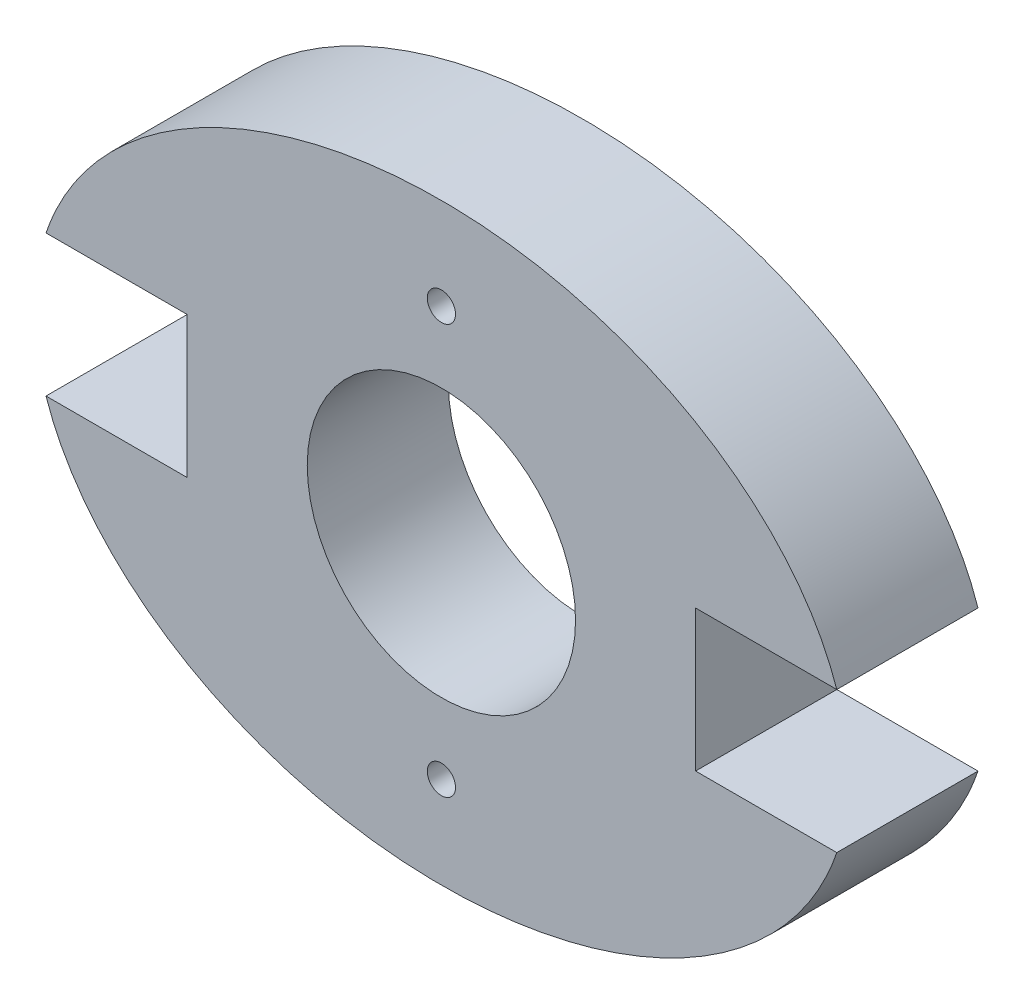
ISO-10303-21;
HEADER;
FILE_DESCRIPTION(('STEP AP214'),'2;1');
FILE_NAME('part.step','',(''),(''),'','','');
FILE_SCHEMA(('AUTOMOTIVE_DESIGN { 1 0 10303 214 1 1 1 1 }'));
ENDSEC;
DATA;
#1=APPLICATION_CONTEXT('core data for automotive mechanical design processes');
#2=APPLICATION_PROTOCOL_DEFINITION('international standard','automotive_design',2000,#1);
#3=PRODUCT_CONTEXT('',#1,'mechanical');
#4=PRODUCT('Part','Part','',(#3));
#5=PRODUCT_RELATED_PRODUCT_CATEGORY('part','',(#4));
#6=PRODUCT_DEFINITION_FORMATION('','',#4);
#7=PRODUCT_DEFINITION_CONTEXT('part definition',#1,'design');
#8=PRODUCT_DEFINITION('design','',#6,#7);
#9=PRODUCT_DEFINITION_SHAPE('','',#8);
#10=(LENGTH_UNIT() NAMED_UNIT(*) SI_UNIT(.MILLI.,.METRE.));
#11=(NAMED_UNIT(*) PLANE_ANGLE_UNIT() SI_UNIT($,.RADIAN.));
#12=(NAMED_UNIT(*) SI_UNIT($,.STERADIAN.) SOLID_ANGLE_UNIT());
#13=UNCERTAINTY_MEASURE_WITH_UNIT(LENGTH_MEASURE(1.E-05),#10,'distance_accuracy_value','');
#14=(GEOMETRIC_REPRESENTATION_CONTEXT(3) GLOBAL_UNCERTAINTY_ASSIGNED_CONTEXT((#13)) GLOBAL_UNIT_ASSIGNED_CONTEXT((#10,
#11,#12)) REPRESENTATION_CONTEXT('',''));
#15=CARTESIAN_POINT('',(0.,0.,0.));
#16=DIRECTION('',(0.,0.,1.));
#17=DIRECTION('',(1.,0.,0.));
#18=AXIS2_PLACEMENT_3D('',#15,#16,#17);
#19=CARTESIAN_POINT('',(0.,0.,5.));
#20=DIRECTION('',(0.,0.,-1.));
#21=DIRECTION('',(-1.,0.,0.));
#22=AXIS2_PLACEMENT_3D('',#19,#20,#21);
#23=PLANE('',#22);
#24=CARTESIAN_POINT('',(0.,-7.25449999999413,5.));
#25=DIRECTION('',(0.,0.,1.));
#26=DIRECTION('',(1.,0.,0.));
#27=AXIS2_PLACEMENT_3D('',#24,#25,#26);
#28=CIRCLE('',#27,0.499999999997022);
#29=CARTESIAN_POINT('',(0.499999999997022,-7.25449999999413,5.));
#30=VERTEX_POINT('',#29);
#31=EDGE_CURVE('E303',#30,#30,#28,.T.);
#32=ORIENTED_EDGE('',*,*,#31,.F.);
#33=EDGE_LOOP('',(#32));
#34=FACE_BOUND('',#33,.T.);
#35=CARTESIAN_POINT('',(0.,0.,5.));
#36=DIRECTION('',(0.,0.,1.));
#37=DIRECTION('',(1.,0.,0.));
#38=AXIS2_PLACEMENT_3D('',#35,#36,#37);
#39=ELLIPSE('',#38,14.4145359326565,10.5);
#40=CARTESIAN_POINT('',(14.,2.5,5.));
#41=VERTEX_POINT('',#40);
#42=CARTESIAN_POINT('',(-14.,2.5,5.));
#43=VERTEX_POINT('',#42);
#44=EDGE_CURVE('E145',#41,#43,#39,.T.);
#45=ORIENTED_EDGE('',*,*,#44,.T.);
#46=DIRECTION('',(1.,0.,0.));
#47=VECTOR('',#46,1.);
#48=CARTESIAN_POINT('',(-14.,2.5,5.));
#49=LINE('',#48,#47);
#50=CARTESIAN_POINT('',(-9.,2.5,5.));
#51=VERTEX_POINT('',#50);
#52=EDGE_CURVE('E93',#43,#51,#49,.T.);
#53=ORIENTED_EDGE('',*,*,#52,.T.);
#54=DIRECTION('',(0.,-1.,0.));
#55=VECTOR('',#54,1.);
#56=CARTESIAN_POINT('',(-9.,2.5,5.));
#57=LINE('',#56,#55);
#58=CARTESIAN_POINT('',(-9.,-2.5,5.));
#59=VERTEX_POINT('',#58);
#60=EDGE_CURVE('E160',#51,#59,#57,.T.);
#61=ORIENTED_EDGE('',*,*,#60,.T.);
#62=DIRECTION('',(-1.,0.,0.));
#63=VECTOR('',#62,1.);
#64=CARTESIAN_POINT('',(-14.,-2.5,5.));
#65=LINE('',#64,#63);
#66=CARTESIAN_POINT('',(-14.,-2.5,5.));
#67=VERTEX_POINT('',#66);
#68=EDGE_CURVE('E173',#59,#67,#65,.T.);
#69=ORIENTED_EDGE('',*,*,#68,.T.);
#70=CARTESIAN_POINT('',(0.,0.,5.));
#71=DIRECTION('',(0.,0.,1.));
#72=DIRECTION('',(1.,0.,0.));
#73=AXIS2_PLACEMENT_3D('',#70,#71,#72);
#74=ELLIPSE('',#73,14.4145359326565,10.5);
#75=CARTESIAN_POINT('',(14.,-2.5,5.));
#76=VERTEX_POINT('',#75);
#77=EDGE_CURVE('E112',#67,#76,#74,.T.);
#78=ORIENTED_EDGE('',*,*,#77,.T.);
#79=DIRECTION('',(-1.,0.,0.));
#80=VECTOR('',#79,1.);
#81=CARTESIAN_POINT('',(14.,-2.5,5.));
#82=LINE('',#81,#80);
#83=CARTESIAN_POINT('',(9.,-2.5,5.));
#84=VERTEX_POINT('',#83);
#85=EDGE_CURVE('E106',#76,#84,#82,.T.);
#86=ORIENTED_EDGE('',*,*,#85,.T.);
#87=DIRECTION('',(0.,1.,0.));
#88=VECTOR('',#87,1.);
#89=CARTESIAN_POINT('',(9.,2.5,5.));
#90=LINE('',#89,#88);
#91=CARTESIAN_POINT('',(9.,2.5,5.));
#92=VERTEX_POINT('',#91);
#93=EDGE_CURVE('E110',#84,#92,#90,.T.);
#94=ORIENTED_EDGE('',*,*,#93,.T.);
#95=DIRECTION('',(1.,0.,0.));
#96=VECTOR('',#95,1.);
#97=CARTESIAN_POINT('',(14.,2.5,5.));
#98=LINE('',#97,#96);
#99=EDGE_CURVE('E50',#92,#41,#98,.T.);
#100=ORIENTED_EDGE('',*,*,#99,.T.);
#101=EDGE_LOOP('',(#45,#53,#61,#69,#78,#86,#94,#100));
#102=FACE_BOUND('',#101,.T.);
#103=CARTESIAN_POINT('',(3.11417199942654E-12,7.25450000000587,5.));
#104=DIRECTION('',(0.,0.,1.));
#105=DIRECTION('',(1.,0.,0.));
#106=AXIS2_PLACEMENT_3D('',#103,#104,#105);
#107=CIRCLE('',#106,0.5);
#108=CARTESIAN_POINT('',(0.500000000003114,7.25450000000587,5.));
#109=VERTEX_POINT('',#108);
#110=EDGE_CURVE('E134',#109,#109,#107,.T.);
#111=ORIENTED_EDGE('',*,*,#110,.F.);
#112=EDGE_LOOP('',(#111));
#113=FACE_BOUND('',#112,.T.);
#114=CARTESIAN_POINT('',(0.,0.,5.));
#115=DIRECTION('',(0.,0.,1.));
#116=DIRECTION('',(1.,0.,0.));
#117=AXIS2_PLACEMENT_3D('',#114,#115,#116);
#118=CIRCLE('',#117,4.75000000000001);
#119=CARTESIAN_POINT('',(4.75000000000001,0.,5.));
#120=VERTEX_POINT('',#119);
#121=EDGE_CURVE('E294',#120,#120,#118,.T.);
#122=ORIENTED_EDGE('',*,*,#121,.F.);
#123=EDGE_LOOP('',(#122));
#124=FACE_BOUND('',#123,.T.);
#125=ADVANCED_FACE('F32',(#34,#102,#113,#124),#23,.F.);
#126=CARTESIAN_POINT('',(0.,0.,0.));
#127=DIRECTION('',(0.,0.,-1.));
#128=DIRECTION('',(-1.,0.,0.));
#129=AXIS2_PLACEMENT_3D('',#126,#127,#128);
#130=PLANE('',#129);
#131=CARTESIAN_POINT('',(0.,-7.25449999999413,0.));
#132=DIRECTION('',(0.,0.,1.));
#133=DIRECTION('',(1.,0.,0.));
#134=AXIS2_PLACEMENT_3D('',#131,#132,#133);
#135=CIRCLE('',#134,0.499999999997022);
#136=CARTESIAN_POINT('',(0.499999999997022,-7.25449999999413,0.));
#137=VERTEX_POINT('',#136);
#138=EDGE_CURVE('E300',#137,#137,#135,.T.);
#139=ORIENTED_EDGE('',*,*,#138,.T.);
#140=EDGE_LOOP('',(#139));
#141=FACE_BOUND('',#140,.T.);
#142=CARTESIAN_POINT('',(0.,0.,0.));
#143=DIRECTION('',(0.,0.,1.));
#144=DIRECTION('',(1.,0.,0.));
#145=AXIS2_PLACEMENT_3D('',#142,#143,#144);
#146=ELLIPSE('',#145,14.4145359326565,10.5);
#147=CARTESIAN_POINT('',(14.,2.5,0.));
#148=VERTEX_POINT('',#147);
#149=CARTESIAN_POINT('',(-14.,2.5,0.));
#150=VERTEX_POINT('',#149);
#151=EDGE_CURVE('E130',#148,#150,#146,.T.);
#152=ORIENTED_EDGE('',*,*,#151,.F.);
#153=DIRECTION('',(1.,0.,0.));
#154=VECTOR('',#153,1.);
#155=CARTESIAN_POINT('',(14.,2.5,0.));
#156=LINE('',#155,#154);
#157=CARTESIAN_POINT('',(9.,2.5,0.));
#158=VERTEX_POINT('',#157);
#159=EDGE_CURVE('E85',#158,#148,#156,.T.);
#160=ORIENTED_EDGE('',*,*,#159,.F.);
#161=DIRECTION('',(0.,1.,0.));
#162=VECTOR('',#161,1.);
#163=CARTESIAN_POINT('',(9.,2.5,0.));
#164=LINE('',#163,#162);
#165=CARTESIAN_POINT('',(9.,-2.5,0.));
#166=VERTEX_POINT('',#165);
#167=EDGE_CURVE('E79',#166,#158,#164,.T.);
#168=ORIENTED_EDGE('',*,*,#167,.F.);
#169=DIRECTION('',(-1.,0.,0.));
#170=VECTOR('',#169,1.);
#171=CARTESIAN_POINT('',(14.,-2.5,0.));
#172=LINE('',#171,#170);
#173=CARTESIAN_POINT('',(14.,-2.5,0.));
#174=VERTEX_POINT('',#173);
#175=EDGE_CURVE('E120',#174,#166,#172,.T.);
#176=ORIENTED_EDGE('',*,*,#175,.F.);
#177=CARTESIAN_POINT('',(0.,0.,0.));
#178=DIRECTION('',(0.,0.,1.));
#179=DIRECTION('',(1.,0.,0.));
#180=AXIS2_PLACEMENT_3D('',#177,#178,#179);
#181=ELLIPSE('',#180,14.4145359326565,10.5);
#182=CARTESIAN_POINT('',(-14.,-2.5,0.));
#183=VERTEX_POINT('',#182);
#184=EDGE_CURVE('E140',#183,#174,#181,.T.);
#185=ORIENTED_EDGE('',*,*,#184,.F.);
#186=DIRECTION('',(-1.,0.,0.));
#187=VECTOR('',#186,1.);
#188=CARTESIAN_POINT('',(-14.,-2.5,0.));
#189=LINE('',#188,#187);
#190=CARTESIAN_POINT('',(-9.,-2.5,0.));
#191=VERTEX_POINT('',#190);
#192=EDGE_CURVE('E138',#191,#183,#189,.T.);
#193=ORIENTED_EDGE('',*,*,#192,.F.);
#194=DIRECTION('',(0.,-1.,0.));
#195=VECTOR('',#194,1.);
#196=CARTESIAN_POINT('',(-9.,2.5,0.));
#197=LINE('',#196,#195);
#198=CARTESIAN_POINT('',(-9.,2.5,0.));
#199=VERTEX_POINT('',#198);
#200=EDGE_CURVE('E136',#199,#191,#197,.T.);
#201=ORIENTED_EDGE('',*,*,#200,.F.);
#202=DIRECTION('',(1.,0.,0.));
#203=VECTOR('',#202,1.);
#204=CARTESIAN_POINT('',(-14.,2.5,0.));
#205=LINE('',#204,#203);
#206=EDGE_CURVE('E133',#150,#199,#205,.T.);
#207=ORIENTED_EDGE('',*,*,#206,.F.);
#208=EDGE_LOOP('',(#152,#160,#168,#176,#185,#193,#201,#207));
#209=FACE_BOUND('',#208,.T.);
#210=CARTESIAN_POINT('',(3.11417199942654E-12,7.25450000000587,0.));
#211=DIRECTION('',(0.,0.,1.));
#212=DIRECTION('',(1.,0.,0.));
#213=AXIS2_PLACEMENT_3D('',#210,#211,#212);
#214=CIRCLE('',#213,0.5);
#215=CARTESIAN_POINT('',(0.500000000003114,7.25450000000587,0.));
#216=VERTEX_POINT('',#215);
#217=EDGE_CURVE('E306',#216,#216,#214,.T.);
#218=ORIENTED_EDGE('',*,*,#217,.T.);
#219=EDGE_LOOP('',(#218));
#220=FACE_BOUND('',#219,.T.);
#221=CARTESIAN_POINT('',(0.,0.,0.));
#222=DIRECTION('',(0.,0.,1.));
#223=DIRECTION('',(1.,0.,0.));
#224=AXIS2_PLACEMENT_3D('',#221,#222,#223);
#225=CIRCLE('',#224,4.75000000000001);
#226=CARTESIAN_POINT('',(4.75000000000001,0.,0.));
#227=VERTEX_POINT('',#226);
#228=EDGE_CURVE('E297',#227,#227,#225,.T.);
#229=ORIENTED_EDGE('',*,*,#228,.T.);
#230=EDGE_LOOP('',(#229));
#231=FACE_BOUND('',#230,.T.);
#232=ADVANCED_FACE('F164',(#141,#209,#220,#231),#130,.T.);
#233=DIRECTION('',(0.,0.,-1.));
#234=VECTOR('',#233,1.);
#235=SURFACE_OF_LINEAR_EXTRUSION('',#39,#234);
#236=ORIENTED_EDGE('',*,*,#151,.T.);
#237=DIRECTION('',(0.,0.,-1.));
#238=VECTOR('',#237,1.);
#239=CARTESIAN_POINT('',(-14.,2.5,5.));
#240=LINE('',#239,#238);
#241=EDGE_CURVE('E11',#43,#150,#240,.T.);
#242=ORIENTED_EDGE('',*,*,#241,.F.);
#243=ORIENTED_EDGE('',*,*,#44,.F.);
#244=DIRECTION('',(0.,0.,-1.));
#245=VECTOR('',#244,1.);
#246=CARTESIAN_POINT('',(14.,2.5,5.));
#247=LINE('',#246,#245);
#248=EDGE_CURVE('E126',#41,#148,#247,.T.);
#249=ORIENTED_EDGE('',*,*,#248,.T.);
#250=EDGE_LOOP('',(#236,#242,#243,#249));
#251=FACE_BOUND('',#250,.T.);
#252=ADVANCED_FACE('F34',(#251),#235,.F.);
#253=CARTESIAN_POINT('',(-14.,2.5,5.));
#254=DIRECTION('',(0.,1.,0.));
#255=DIRECTION('',(0.,0.,1.));
#256=AXIS2_PLACEMENT_3D('',#253,#254,#255);
#257=PLANE('',#256);
#258=ORIENTED_EDGE('',*,*,#206,.T.);
#259=DIRECTION('',(0.,0.,-1.));
#260=VECTOR('',#259,1.);
#261=CARTESIAN_POINT('',(-9.,2.5,5.));
#262=LINE('',#261,#260);
#263=EDGE_CURVE('E42',#51,#199,#262,.T.);
#264=ORIENTED_EDGE('',*,*,#263,.F.);
#265=ORIENTED_EDGE('',*,*,#52,.F.);
#266=ORIENTED_EDGE('',*,*,#241,.T.);
#267=EDGE_LOOP('',(#258,#264,#265,#266));
#268=FACE_BOUND('',#267,.T.);
#269=ADVANCED_FACE('F185',(#268),#257,.F.);
#270=CARTESIAN_POINT('',(-9.,2.5,5.));
#271=DIRECTION('',(1.,0.,0.));
#272=DIRECTION('',(0.,0.,-1.));
#273=AXIS2_PLACEMENT_3D('',#270,#271,#272);
#274=PLANE('',#273);
#275=ORIENTED_EDGE('',*,*,#200,.T.);
#276=DIRECTION('',(0.,0.,-1.));
#277=VECTOR('',#276,1.);
#278=CARTESIAN_POINT('',(-9.,-2.5,5.));
#279=LINE('',#278,#277);
#280=EDGE_CURVE('E152',#59,#191,#279,.T.);
#281=ORIENTED_EDGE('',*,*,#280,.F.);
#282=ORIENTED_EDGE('',*,*,#60,.F.);
#283=ORIENTED_EDGE('',*,*,#263,.T.);
#284=EDGE_LOOP('',(#275,#281,#282,#283));
#285=FACE_BOUND('',#284,.T.);
#286=ADVANCED_FACE('F158',(#285),#274,.F.);
#287=CARTESIAN_POINT('',(-14.,-2.5,5.));
#288=DIRECTION('',(0.,-1.,0.));
#289=DIRECTION('',(0.,0.,-1.));
#290=AXIS2_PLACEMENT_3D('',#287,#288,#289);
#291=PLANE('',#290);
#292=ORIENTED_EDGE('',*,*,#192,.T.);
#293=DIRECTION('',(0.,0.,-1.));
#294=VECTOR('',#293,1.);
#295=CARTESIAN_POINT('',(-14.,-2.5,5.));
#296=LINE('',#295,#294);
#297=EDGE_CURVE('E149',#67,#183,#296,.T.);
#298=ORIENTED_EDGE('',*,*,#297,.F.);
#299=ORIENTED_EDGE('',*,*,#68,.F.);
#300=ORIENTED_EDGE('',*,*,#280,.T.);
#301=EDGE_LOOP('',(#292,#298,#299,#300));
#302=FACE_BOUND('',#301,.T.);
#303=ADVANCED_FACE('F169',(#302),#291,.F.);
#304=DIRECTION('',(0.,0.,-1.));
#305=VECTOR('',#304,1.);
#306=SURFACE_OF_LINEAR_EXTRUSION('',#74,#305);
#307=ORIENTED_EDGE('',*,*,#184,.T.);
#308=DIRECTION('',(0.,0.,-1.));
#309=VECTOR('',#308,1.);
#310=CARTESIAN_POINT('',(14.,-2.5,5.));
#311=LINE('',#310,#309);
#312=EDGE_CURVE('E121',#76,#174,#311,.T.);
#313=ORIENTED_EDGE('',*,*,#312,.F.);
#314=ORIENTED_EDGE('',*,*,#77,.F.);
#315=ORIENTED_EDGE('',*,*,#297,.T.);
#316=EDGE_LOOP('',(#307,#313,#314,#315));
#317=FACE_BOUND('',#316,.T.);
#318=ADVANCED_FACE('F172',(#317),#306,.F.);
#319=CARTESIAN_POINT('',(14.,-2.5,5.));
#320=DIRECTION('',(0.,-1.,0.));
#321=DIRECTION('',(0.,0.,-1.));
#322=AXIS2_PLACEMENT_3D('',#319,#320,#321);
#323=PLANE('',#322);
#324=ORIENTED_EDGE('',*,*,#175,.T.);
#325=DIRECTION('',(0.,0.,-1.));
#326=VECTOR('',#325,1.);
#327=CARTESIAN_POINT('',(9.,-2.5,5.));
#328=LINE('',#327,#326);
#329=EDGE_CURVE('E117',#84,#166,#328,.T.);
#330=ORIENTED_EDGE('',*,*,#329,.F.);
#331=ORIENTED_EDGE('',*,*,#85,.F.);
#332=ORIENTED_EDGE('',*,*,#312,.T.);
#333=EDGE_LOOP('',(#324,#330,#331,#332));
#334=FACE_BOUND('',#333,.T.);
#335=ADVANCED_FACE('F118',(#334),#323,.F.);
#336=CARTESIAN_POINT('',(9.,2.5,5.));
#337=DIRECTION('',(-1.,0.,0.));
#338=DIRECTION('',(0.,0.,1.));
#339=AXIS2_PLACEMENT_3D('',#336,#337,#338);
#340=PLANE('',#339);
#341=ORIENTED_EDGE('',*,*,#167,.T.);
#342=DIRECTION('',(0.,0.,-1.));
#343=VECTOR('',#342,1.);
#344=CARTESIAN_POINT('',(9.,2.5,5.));
#345=LINE('',#344,#343);
#346=EDGE_CURVE('E122',#92,#158,#345,.T.);
#347=ORIENTED_EDGE('',*,*,#346,.F.);
#348=ORIENTED_EDGE('',*,*,#93,.F.);
#349=ORIENTED_EDGE('',*,*,#329,.T.);
#350=EDGE_LOOP('',(#341,#347,#348,#349));
#351=FACE_BOUND('',#350,.T.);
#352=ADVANCED_FACE('F124',(#351),#340,.F.);
#353=CARTESIAN_POINT('',(14.,2.5,5.));
#354=DIRECTION('',(0.,1.,0.));
#355=DIRECTION('',(0.,0.,1.));
#356=AXIS2_PLACEMENT_3D('',#353,#354,#355);
#357=PLANE('',#356);
#358=ORIENTED_EDGE('',*,*,#159,.T.);
#359=ORIENTED_EDGE('',*,*,#248,.F.);
#360=ORIENTED_EDGE('',*,*,#99,.F.);
#361=ORIENTED_EDGE('',*,*,#346,.T.);
#362=EDGE_LOOP('',(#358,#359,#360,#361));
#363=FACE_BOUND('',#362,.T.);
#364=ADVANCED_FACE('F204',(#363),#357,.F.);
#365=CARTESIAN_POINT('',(3.11417199942654E-12,7.25450000000587,5.));
#366=DIRECTION('',(0.,0.,-1.));
#367=DIRECTION('',(-1.,0.,0.));
#368=AXIS2_PLACEMENT_3D('',#365,#366,#367);
#369=CYLINDRICAL_SURFACE('',#368,0.5);
#370=ORIENTED_EDGE('',*,*,#110,.T.);
#371=EDGE_LOOP('',(#370));
#372=FACE_BOUND('',#371,.T.);
#373=ORIENTED_EDGE('',*,*,#217,.F.);
#374=EDGE_LOOP('',(#373));
#375=FACE_BOUND('',#374,.T.);
#376=ADVANCED_FACE('F201',(#372,#375),#369,.F.);
#377=CARTESIAN_POINT('',(0.,-7.25449999999413,5.));
#378=DIRECTION('',(0.,0.,-1.));
#379=DIRECTION('',(-1.,0.,0.));
#380=AXIS2_PLACEMENT_3D('',#377,#378,#379);
#381=CYLINDRICAL_SURFACE('',#380,0.499999999997022);
#382=ORIENTED_EDGE('',*,*,#31,.T.);
#383=EDGE_LOOP('',(#382));
#384=FACE_BOUND('',#383,.T.);
#385=ORIENTED_EDGE('',*,*,#138,.F.);
#386=EDGE_LOOP('',(#385));
#387=FACE_BOUND('',#386,.T.);
#388=ADVANCED_FACE('F269',(#384,#387),#381,.F.);
#389=CARTESIAN_POINT('',(0.,0.,5.));
#390=DIRECTION('',(0.,0.,-1.));
#391=DIRECTION('',(-1.,0.,0.));
#392=AXIS2_PLACEMENT_3D('',#389,#390,#391);
#393=CYLINDRICAL_SURFACE('',#392,4.75000000000001);
#394=ORIENTED_EDGE('',*,*,#121,.T.);
#395=EDGE_LOOP('',(#394));
#396=FACE_BOUND('',#395,.T.);
#397=ORIENTED_EDGE('',*,*,#228,.F.);
#398=EDGE_LOOP('',(#397));
#399=FACE_BOUND('',#398,.T.);
#400=ADVANCED_FACE('F277',(#396,#399),#393,.F.);
#401=CLOSED_SHELL('',(#125,#232,#252,#269,#286,#303,#318,#335,#352,#364,#376,#388,#400));
#402=MANIFOLD_SOLID_BREP('B2',#401);
#403=ADVANCED_BREP_SHAPE_REPRESENTATION('',(#18,#402),#14);
#404=SHAPE_DEFINITION_REPRESENTATION(#9,#403);
ENDSEC;
END-ISO-10303-21;
